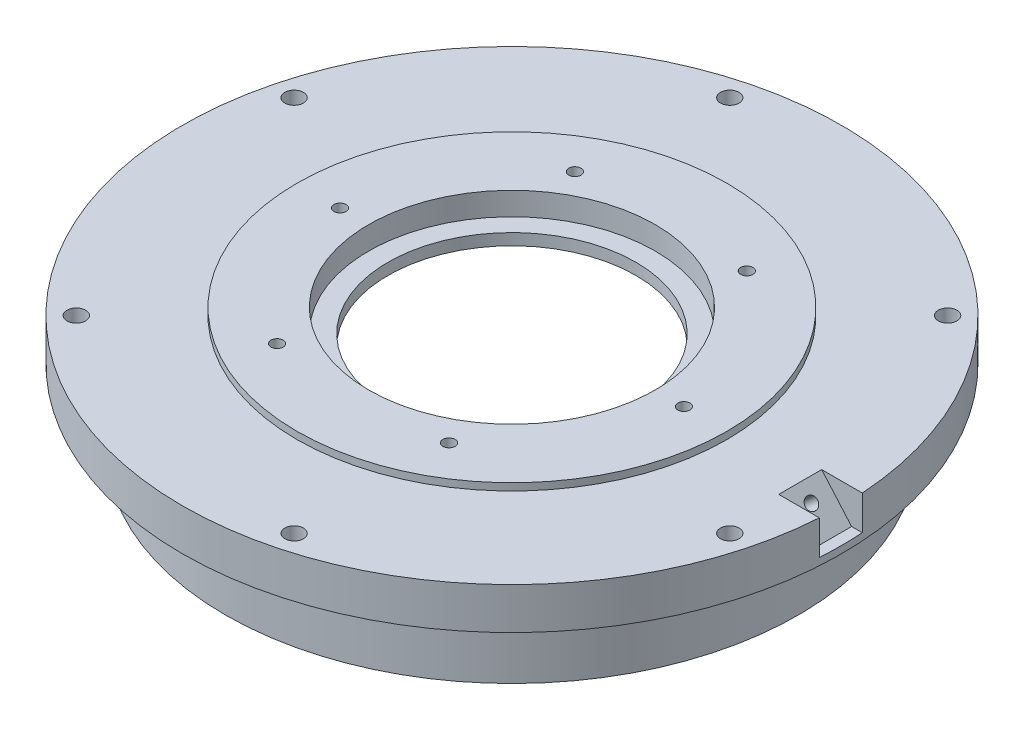
ISO-10303-21;
HEADER;
FILE_DESCRIPTION(('STEP AP214'),'2;1');
FILE_NAME('part.step','',(''),(''),'','','');
FILE_SCHEMA(('AUTOMOTIVE_DESIGN { 1 0 10303 214 1 1 1 1 }'));
ENDSEC;
DATA;
#1=APPLICATION_CONTEXT('core data for automotive mechanical design processes');
#2=APPLICATION_PROTOCOL_DEFINITION('international standard','automotive_design',2000,#1);
#3=PRODUCT_CONTEXT('',#1,'mechanical');
#4=PRODUCT('Part','Part','',(#3));
#5=PRODUCT_RELATED_PRODUCT_CATEGORY('part','',(#4));
#6=PRODUCT_DEFINITION_FORMATION('','',#4);
#7=PRODUCT_DEFINITION_CONTEXT('part definition',#1,'design');
#8=PRODUCT_DEFINITION('design','',#6,#7);
#9=PRODUCT_DEFINITION_SHAPE('','',#8);
#10=(LENGTH_UNIT() NAMED_UNIT(*) SI_UNIT(.MILLI.,.METRE.));
#11=(NAMED_UNIT(*) PLANE_ANGLE_UNIT() SI_UNIT($,.RADIAN.));
#12=(NAMED_UNIT(*) SI_UNIT($,.STERADIAN.) SOLID_ANGLE_UNIT());
#13=UNCERTAINTY_MEASURE_WITH_UNIT(LENGTH_MEASURE(1.E-05),#10,'distance_accuracy_value','');
#14=(GEOMETRIC_REPRESENTATION_CONTEXT(3) GLOBAL_UNCERTAINTY_ASSIGNED_CONTEXT((#13)) GLOBAL_UNIT_ASSIGNED_CONTEXT((#10,
#11,#12)) REPRESENTATION_CONTEXT('',''));
#15=CARTESIAN_POINT('',(0.,0.,0.));
#16=DIRECTION('',(0.,0.,1.));
#17=DIRECTION('',(1.,0.,0.));
#18=AXIS2_PLACEMENT_3D('',#15,#16,#17);
#19=CARTESIAN_POINT('',(0.,0.,0.));
#20=DIRECTION('',(0.,1.,0.));
#21=DIRECTION('',(0.,0.,1.));
#22=AXIS2_PLACEMENT_3D('',#19,#20,#21);
#23=CYLINDRICAL_SURFACE('',#22,230.);
#24=DIRECTION('',(0.,1.,0.));
#25=VECTOR('',#24,1.);
#26=CARTESIAN_POINT('',(229.51034835057,0.,-15.));
#27=LINE('',#26,#25);
#28=CARTESIAN_POINT('',(229.51034835057,-29.,-15.));
#29=VERTEX_POINT('',#28);
#30=CARTESIAN_POINT('',(229.51034835057,-5.,-15.));
#31=VERTEX_POINT('',#30);
#32=EDGE_CURVE('E82',#29,#31,#27,.T.);
#33=ORIENTED_EDGE('',*,*,#32,.F.);
#34=CARTESIAN_POINT('',(0.,-29.,0.));
#35=DIRECTION('',(0.,-1.,0.));
#36=DIRECTION('',(0.,0.,-1.));
#37=AXIS2_PLACEMENT_3D('',#34,#35,#36);
#38=CIRCLE('',#37,230.);
#39=CARTESIAN_POINT('',(229.51034835057,-29.,15.));
#40=VERTEX_POINT('',#39);
#41=EDGE_CURVE('E11',#40,#29,#38,.F.);
#42=ORIENTED_EDGE('',*,*,#41,.F.);
#43=DIRECTION('',(0.,1.,0.));
#44=VECTOR('',#43,1.);
#45=CARTESIAN_POINT('',(229.51034835057,0.,15.));
#46=LINE('',#45,#44);
#47=CARTESIAN_POINT('',(229.51034835057,-5.,15.));
#48=VERTEX_POINT('',#47);
#49=EDGE_CURVE('E99',#40,#48,#46,.T.);
#50=ORIENTED_EDGE('',*,*,#49,.T.);
#51=CARTESIAN_POINT('',(0.,-5.,0.));
#52=DIRECTION('',(0.,1.,0.));
#53=DIRECTION('',(0.,0.,1.));
#54=AXIS2_PLACEMENT_3D('',#51,#52,#53);
#55=CIRCLE('',#54,230.);
#56=EDGE_CURVE('E110',#31,#48,#55,.T.);
#57=ORIENTED_EDGE('',*,*,#56,.F.);
#58=EDGE_LOOP('',(#33,#42,#50,#57));
#59=FACE_BOUND('',#58,.T.);
#60=CARTESIAN_POINT('',(0.,-34.,0.));
#61=DIRECTION('',(0.,1.,0.));
#62=DIRECTION('',(0.,0.,1.));
#63=AXIS2_PLACEMENT_3D('',#60,#61,#62);
#64=CIRCLE('',#63,230.);
#65=CARTESIAN_POINT('',(0.,-34.,230.));
#66=VERTEX_POINT('',#65);
#67=EDGE_CURVE('E112',#66,#66,#64,.T.);
#68=ORIENTED_EDGE('',*,*,#67,.T.);
#69=EDGE_LOOP('',(#68));
#70=FACE_BOUND('',#69,.T.);
#71=ADVANCED_FACE('F36',(#59,#70),#23,.T.);
#72=CARTESIAN_POINT('',(0.,0.,0.));
#73=DIRECTION('',(0.,1.,0.));
#74=DIRECTION('',(0.,0.,1.));
#75=AXIS2_PLACEMENT_3D('',#72,#73,#74);
#76=CYLINDRICAL_SURFACE('',#75,150.);
#77=CARTESIAN_POINT('',(0.,-5.,0.));
#78=DIRECTION('',(0.,1.,0.));
#79=DIRECTION('',(0.,0.,1.));
#80=AXIS2_PLACEMENT_3D('',#77,#78,#79);
#81=CIRCLE('',#80,150.);
#82=CARTESIAN_POINT('',(0.,-5.,150.));
#83=VERTEX_POINT('',#82);
#84=EDGE_CURVE('E107',#83,#83,#81,.T.);
#85=ORIENTED_EDGE('',*,*,#84,.T.);
#86=EDGE_LOOP('',(#85));
#87=FACE_BOUND('',#86,.T.);
#88=CARTESIAN_POINT('',(0.,0.,0.));
#89=DIRECTION('',(0.,1.,0.));
#90=DIRECTION('',(0.,0.,1.));
#91=AXIS2_PLACEMENT_3D('',#88,#89,#90);
#92=CIRCLE('',#91,150.);
#93=CARTESIAN_POINT('',(0.,0.,150.));
#94=VERTEX_POINT('',#93);
#95=EDGE_CURVE('E154',#94,#94,#92,.T.);
#96=ORIENTED_EDGE('',*,*,#95,.F.);
#97=EDGE_LOOP('',(#96));
#98=FACE_BOUND('',#97,.T.);
#99=ADVANCED_FACE('F38',(#87,#98),#76,.T.);
#100=CARTESIAN_POINT('',(-150.,0.,0.));
#101=DIRECTION('',(0.,1.,0.));
#102=DIRECTION('',(0.,0.,1.));
#103=AXIS2_PLACEMENT_3D('',#100,#101,#102);
#104=PLANE('',#103);
#105=CARTESIAN_POINT('',(60.0000000000012,0.,103.923048454132));
#106=DIRECTION('',(0.,1.,0.));
#107=DIRECTION('',(-0.866025403784433,0.,0.50000000000001));
#108=AXIS2_PLACEMENT_3D('',#105,#106,#107);
#109=CIRCLE('',#108,4.25000000000001);
#110=CARTESIAN_POINT('',(56.3193920339174,0.,106.048048454132));
#111=VERTEX_POINT('',#110);
#112=EDGE_CURVE('E476',#111,#111,#109,.T.);
#113=ORIENTED_EDGE('',*,*,#112,.F.);
#114=EDGE_LOOP('',(#113));
#115=FACE_BOUND('',#114,.T.);
#116=CARTESIAN_POINT('',(-59.999999999999,0.,103.923048454133));
#117=DIRECTION('',(0.,1.,0.));
#118=DIRECTION('',(-0.866025403784443,0.,-0.499999999999992));
#119=AXIS2_PLACEMENT_3D('',#116,#117,#118);
#120=CIRCLE('',#119,4.25000000000001);
#121=CARTESIAN_POINT('',(-63.6806079660829,0.,101.798048454133));
#122=VERTEX_POINT('',#121);
#123=EDGE_CURVE('E495',#122,#122,#120,.T.);
#124=ORIENTED_EDGE('',*,*,#123,.F.);
#125=EDGE_LOOP('',(#124));
#126=FACE_BOUND('',#125,.T.);
#127=CARTESIAN_POINT('',(-120.,0.,0.));
#128=DIRECTION('',(0.,1.,0.));
#129=DIRECTION('',(0.,0.,-1.));
#130=AXIS2_PLACEMENT_3D('',#127,#128,#129);
#131=CIRCLE('',#130,4.25000000000001);
#132=CARTESIAN_POINT('',(-120.,0.,-4.25000000000001));
#133=VERTEX_POINT('',#132);
#134=EDGE_CURVE('E489',#133,#133,#131,.T.);
#135=ORIENTED_EDGE('',*,*,#134,.F.);
#136=EDGE_LOOP('',(#135));
#137=FACE_BOUND('',#136,.T.);
#138=CARTESIAN_POINT('',(-60.0000000000005,0.,-103.923048454132));
#139=DIRECTION('',(0.,1.,0.));
#140=DIRECTION('',(0.866025403784436,0.,-0.500000000000004));
#141=AXIS2_PLACEMENT_3D('',#138,#139,#140);
#142=CIRCLE('',#141,4.25000000000001);
#143=CARTESIAN_POINT('',(-56.3193920339166,0.,-106.048048454132));
#144=VERTEX_POINT('',#143);
#145=EDGE_CURVE('E483',#144,#144,#142,.T.);
#146=ORIENTED_EDGE('',*,*,#145,.F.);
#147=EDGE_LOOP('',(#146));
#148=FACE_BOUND('',#147,.T.);
#149=CARTESIAN_POINT('',(59.9999999999998,0.,-103.923048454133));
#150=DIRECTION('',(0.,1.,0.));
#151=DIRECTION('',(0.86602540378444,0.,0.499999999999998));
#152=AXIS2_PLACEMENT_3D('',#149,#150,#151);
#153=CIRCLE('',#152,4.25000000000001);
#154=CARTESIAN_POINT('',(63.6806079660836,0.,-101.798048454133));
#155=VERTEX_POINT('',#154);
#156=EDGE_CURVE('E482',#155,#155,#153,.T.);
#157=ORIENTED_EDGE('',*,*,#156,.F.);
#158=EDGE_LOOP('',(#157));
#159=FACE_BOUND('',#158,.T.);
#160=CARTESIAN_POINT('',(120.,0.,0.));
#161=DIRECTION('',(0.,1.,0.));
#162=DIRECTION('',(0.,0.,1.));
#163=AXIS2_PLACEMENT_3D('',#160,#161,#162);
#164=CIRCLE('',#163,4.25000000000001);
#165=CARTESIAN_POINT('',(120.,0.,4.25000000000001));
#166=VERTEX_POINT('',#165);
#167=EDGE_CURVE('E506',#166,#166,#164,.T.);
#168=ORIENTED_EDGE('',*,*,#167,.F.);
#169=EDGE_LOOP('',(#168));
#170=FACE_BOUND('',#169,.T.);
#171=ORIENTED_EDGE('',*,*,#95,.T.);
#172=EDGE_LOOP('',(#171));
#173=FACE_BOUND('',#172,.T.);
#174=CARTESIAN_POINT('',(0.,0.,0.));
#175=DIRECTION('',(0.,1.,0.));
#176=DIRECTION('',(0.,0.,1.));
#177=AXIS2_PLACEMENT_3D('',#174,#175,#176);
#178=CIRCLE('',#177,100.);
#179=CARTESIAN_POINT('',(0.,0.,100.));
#180=VERTEX_POINT('',#179);
#181=EDGE_CURVE('E151',#180,#180,#178,.T.);
#182=ORIENTED_EDGE('',*,*,#181,.F.);
#183=EDGE_LOOP('',(#182));
#184=FACE_BOUND('',#183,.T.);
#185=ADVANCED_FACE('F159',(#115,#126,#137,#148,#159,#170,#173,#184),#104,.T.);
#186=CARTESIAN_POINT('',(0.,0.,0.));
#187=DIRECTION('',(0.,1.,0.));
#188=DIRECTION('',(0.,0.,1.));
#189=AXIS2_PLACEMENT_3D('',#186,#187,#188);
#190=CYLINDRICAL_SURFACE('',#189,100.);
#191=ORIENTED_EDGE('',*,*,#181,.T.);
#192=EDGE_LOOP('',(#191));
#193=FACE_BOUND('',#192,.T.);
#194=CARTESIAN_POINT('',(0.,-16.,0.));
#195=DIRECTION('',(0.,1.,0.));
#196=DIRECTION('',(0.,0.,1.));
#197=AXIS2_PLACEMENT_3D('',#194,#195,#196);
#198=CIRCLE('',#197,100.);
#199=CARTESIAN_POINT('',(0.,-16.,100.));
#200=VERTEX_POINT('',#199);
#201=EDGE_CURVE('E148',#200,#200,#198,.T.);
#202=ORIENTED_EDGE('',*,*,#201,.F.);
#203=EDGE_LOOP('',(#202));
#204=FACE_BOUND('',#203,.T.);
#205=ADVANCED_FACE('F168',(#193,#204),#190,.F.);
#206=CARTESIAN_POINT('',(-100.,-16.,0.));
#207=DIRECTION('',(0.,1.,0.));
#208=DIRECTION('',(0.,0.,1.));
#209=AXIS2_PLACEMENT_3D('',#206,#207,#208);
#210=PLANE('',#209);
#211=ORIENTED_EDGE('',*,*,#201,.T.);
#212=EDGE_LOOP('',(#211));
#213=FACE_BOUND('',#212,.T.);
#214=CARTESIAN_POINT('',(0.,-16.,0.));
#215=DIRECTION('',(0.,1.,0.));
#216=DIRECTION('',(0.,0.,1.));
#217=AXIS2_PLACEMENT_3D('',#214,#215,#216);
#218=CIRCLE('',#217,86.5);
#219=CARTESIAN_POINT('',(0.,-16.,86.5));
#220=VERTEX_POINT('',#219);
#221=EDGE_CURVE('E145',#220,#220,#218,.T.);
#222=ORIENTED_EDGE('',*,*,#221,.F.);
#223=EDGE_LOOP('',(#222));
#224=FACE_BOUND('',#223,.T.);
#225=ADVANCED_FACE('F228',(#213,#224),#210,.T.);
#226=CARTESIAN_POINT('',(0.,0.,0.));
#227=DIRECTION('',(0.,1.,0.));
#228=DIRECTION('',(0.,0.,1.));
#229=AXIS2_PLACEMENT_3D('',#226,#227,#228);
#230=CYLINDRICAL_SURFACE('',#229,86.5);
#231=ORIENTED_EDGE('',*,*,#221,.T.);
#232=EDGE_LOOP('',(#231));
#233=FACE_BOUND('',#232,.T.);
#234=CARTESIAN_POINT('',(0.,-24.,0.));
#235=DIRECTION('',(0.,1.,0.));
#236=DIRECTION('',(0.,0.,1.));
#237=AXIS2_PLACEMENT_3D('',#234,#235,#236);
#238=CIRCLE('',#237,86.5);
#239=CARTESIAN_POINT('',(0.,-24.,86.5));
#240=VERTEX_POINT('',#239);
#241=EDGE_CURVE('E142',#240,#240,#238,.T.);
#242=ORIENTED_EDGE('',*,*,#241,.F.);
#243=EDGE_LOOP('',(#242));
#244=FACE_BOUND('',#243,.T.);
#245=ADVANCED_FACE('F224',(#233,#244),#230,.F.);
#246=CARTESIAN_POINT('',(-86.5,-24.,0.));
#247=DIRECTION('',(0.,-1.,0.));
#248=DIRECTION('',(0.,0.,-1.));
#249=AXIS2_PLACEMENT_3D('',#246,#247,#248);
#250=PLANE('',#249);
#251=ORIENTED_EDGE('',*,*,#241,.T.);
#252=EDGE_LOOP('',(#251));
#253=FACE_BOUND('',#252,.T.);
#254=CARTESIAN_POINT('',(0.,-24.,0.));
#255=DIRECTION('',(0.,1.,0.));
#256=DIRECTION('',(0.,0.,1.));
#257=AXIS2_PLACEMENT_3D('',#254,#255,#256);
#258=CIRCLE('',#257,170.);
#259=CARTESIAN_POINT('',(0.,-24.,170.));
#260=VERTEX_POINT('',#259);
#261=EDGE_CURVE('E139',#260,#260,#258,.T.);
#262=ORIENTED_EDGE('',*,*,#261,.F.);
#263=EDGE_LOOP('',(#262));
#264=FACE_BOUND('',#263,.T.);
#265=ADVANCED_FACE('F220',(#253,#264),#250,.T.);
#266=CARTESIAN_POINT('',(0.,-43.9999999999999,0.));
#267=DIRECTION('',(0.,-1.,0.));
#268=DIRECTION('',(0.,0.,-1.));
#269=AXIS2_PLACEMENT_3D('',#266,#267,#268);
#270=CONICAL_SURFACE('',#269,190.,0.78539816339745);
#271=CARTESIAN_POINT('',(180.511481727089,-34.5274734512081,-2.40283902239297));
#272=CARTESIAN_POINT('',(180.417233751974,-34.4308468569237,-2.2234780199374));
#273=CARTESIAN_POINT('',(180.33356404573,-34.344909079238,-2.032597699933));
#274=CARTESIAN_POINT('',(180.189775458586,-34.1970673732498,-1.63325241196564));
#275=CARTESIAN_POINT('',(180.129684608111,-34.1351920510489,-1.42476687047765));
#276=CARTESIAN_POINT('',(180.034804585052,-34.0374346822704,-0.996342846806657));
#277=CARTESIAN_POINT('',(180.000004259494,-34.0015411778919,-0.776409458967654));
#278=CARTESIAN_POINT('',(179.956627915975,-33.9567954827483,-0.331328957005012));
#279=CARTESIAN_POINT('',(179.948045470409,-33.9479366641318,-0.106183134407568));
#280=CARTESIAN_POINT('',(179.957314381785,-33.9575010343507,0.342899428680555));
#281=CARTESIAN_POINT('',(179.975155944447,-33.9759141146289,0.566836586298707));
#282=CARTESIAN_POINT('',(180.036772613076,-34.0394555678606,1.00723581334373));
#283=CARTESIAN_POINT('',(180.080548675786,-34.0845849263987,1.22369760668672));
#284=CARTESIAN_POINT('',(180.192845305135,-34.2002140488859,1.64300121440554));
#285=CARTESIAN_POINT('',(180.261366291176,-34.2707142428479,1.84584279786193));
#286=CARTESIAN_POINT('',(180.421284156504,-34.4349890954986,2.23215755355802));
#287=CARTESIAN_POINT('',(180.512681040898,-34.5287637593838,2.41563072147336));
#288=CARTESIAN_POINT('',(180.715927374345,-34.73689419222,2.75815683736391));
#289=CARTESIAN_POINT('',(180.827792227841,-34.8512654613978,2.91719122542888));
#290=CARTESIAN_POINT('',(181.068851305519,-35.097178967482,3.20619213860116));
#291=CARTESIAN_POINT('',(181.198045611861,-35.2287212857972,3.3361585258879));
#292=CARTESIAN_POINT('',(181.470397641728,-35.5053489277674,3.5635488521173));
#293=CARTESIAN_POINT('',(181.613575765738,-35.6504540240012,3.66092430084878));
#294=CARTESIAN_POINT('',(181.909751821622,-35.94984321983,3.82014886302381));
#295=CARTESIAN_POINT('',(182.062749869685,-36.104127428032,3.88199755602417));
#296=CARTESIAN_POINT('',(182.374597688186,-36.4177666692115,3.96854263634386));
#297=CARTESIAN_POINT('',(182.533458393194,-36.5771310933327,3.99316559040498));
#298=CARTESIAN_POINT('',(182.852267392597,-36.8961087135291,4.00435946357775));
#299=CARTESIAN_POINT('',(183.012215699137,-37.0557219123671,3.99092995703211));
#300=CARTESIAN_POINT('',(183.328934761978,-37.3709719269589,3.92635725395824));
#301=CARTESIAN_POINT('',(183.485699595893,-37.5266014507916,3.87514939325692));
#302=CARTESIAN_POINT('',(183.79127306051,-37.8292345310411,3.73639357281012));
#303=CARTESIAN_POINT('',(183.940081646377,-37.9762380388484,3.64884540830173));
#304=CARTESIAN_POINT('',(184.225488641976,-38.2575687790778,3.43983132564265));
#305=CARTESIAN_POINT('',(184.362082590036,-38.3918913805021,3.31835308003129));
#306=CARTESIAN_POINT('',(184.619000646752,-38.644056591843,3.0449093930945));
#307=CARTESIAN_POINT('',(184.73932486336,-38.7618993111063,2.89294415407188));
#308=CARTESIAN_POINT('',(184.959954884075,-38.9776384652508,2.56309374706751));
#309=CARTESIAN_POINT('',(185.060293885397,-39.0755679834817,2.38525242665819));
#310=CARTESIAN_POINT('',(185.23820580474,-39.248997599873,2.00849332834165));
#311=CARTESIAN_POINT('',(185.315779119433,-39.3244980888395,1.80957591774866));
#312=CARTESIAN_POINT('',(185.445611355287,-39.4507581947692,1.39698082028717));
#313=CARTESIAN_POINT('',(185.497949277683,-39.5015950262511,1.18335162179619));
#314=CARTESIAN_POINT('',(185.576087662446,-39.5774620481559,0.746857743241874));
#315=CARTESIAN_POINT('',(185.601888613473,-39.6024927137826,0.523993233319401));
#316=CARTESIAN_POINT('',(185.626133265338,-39.6260140839588,0.076033152858678));
#317=CARTESIAN_POINT('',(185.624654491483,-39.6245799977673,-0.149054278942545));
#318=CARTESIAN_POINT('',(185.594575,-39.5953965331394,-0.595681484608237));
#319=CARTESIAN_POINT('',(185.565974468482,-39.5676473352775,-0.817221282805989));
#320=CARTESIAN_POINT('',(185.482547999953,-39.4866353662249,-1.25030987727162));
#321=CARTESIAN_POINT('',(185.427740552024,-39.4333905822322,-1.46186560190974));
#322=CARTESIAN_POINT('',(185.293556166725,-39.3028710785216,-1.86918068623923));
#323=CARTESIAN_POINT('',(185.214179057242,-39.2255961904688,-2.06493993526162));
#324=CARTESIAN_POINT('',(185.033047629421,-39.0489816312082,-2.43551695079216));
#325=CARTESIAN_POINT('',(184.931251195398,-38.9496004287566,-2.61029433422254));
#326=CARTESIAN_POINT('',(184.708377048393,-38.7315991770255,-2.93358281084903));
#327=CARTESIAN_POINT('',(184.587298963637,-38.6129787567888,-3.08209339747152));
#328=CARTESIAN_POINT('',(184.328978379176,-38.3593514839948,-3.34914251772261));
#329=CARTESIAN_POINT('',(184.19168475309,-38.2242927595357,-3.46758233319602));
#330=CARTESIAN_POINT('',(183.905237055448,-37.9418338457152,-3.67055010071141));
#331=CARTESIAN_POINT('',(183.756082772966,-37.7944334368681,-3.75507744949642));
#332=CARTESIAN_POINT('',(183.449797865174,-37.4909813037307,-3.88803096102671));
#333=CARTESIAN_POINT('',(183.292647273198,-37.3349078235053,-3.93636148843971));
#334=CARTESIAN_POINT('',(182.975240208342,-37.0188485761472,-3.99518489632217));
#335=CARTESIAN_POINT('',(182.81498383805,-36.8588629381914,-4.00567902443123));
#336=CARTESIAN_POINT('',(182.495820825803,-36.5394008114623,-3.98851556360043));
#337=CARTESIAN_POINT('',(182.336915048049,-36.3799246842607,-3.96083516222548));
#338=CARTESIAN_POINT('',(182.0250055317,-36.0660934677611,-3.86802032870164));
#339=CARTESIAN_POINT('',(181.872003237831,-35.9117396332902,-3.80287678966883));
#340=CARTESIAN_POINT('',(181.576362672954,-35.612766816628,-3.63702283876253));
#341=CARTESIAN_POINT('',(181.433717720099,-35.4681415627347,-3.53633560751533));
#342=CARTESIAN_POINT('',(181.162788765661,-35.1928477698761,-3.30228037916537));
#343=CARTESIAN_POINT('',(181.034487588089,-35.0621625471841,-3.16895209219441));
#344=CARTESIAN_POINT('',(180.840380576431,-34.8640722364197,-2.92876870588417));
#345=CARTESIAN_POINT('',(180.769129084576,-34.7912608924969,-2.83062119052432));
#346=CARTESIAN_POINT('',(180.634348001269,-34.6533786072348,-2.62411742714774));
#347=CARTESIAN_POINT('',(180.570818402321,-34.5883076583822,-2.51576118904033));
#348=CARTESIAN_POINT('',(180.511481727089,-34.5274734512081,-2.40283902239297));
#349=B_SPLINE_CURVE_WITH_KNOTS('',3,(#271,#272,#273,#274,#275,#276,#277,#278,#279,#280,#281,
#282,#283,#284,#285,#286,#287,#288,#289,#290,#291,#292,#293,#294,#295,#296,#297,#298,#299,#300,
#301,#302,#303,#304,#305,#306,#307,#308,#309,#310,#311,#312,#313,#314,#315,#316,#317,#318,#319,
#320,#321,#322,#323,#324,#325,#326,#327,#328,#329,#330,#331,#332,#333,#334,#335,#336,#337,#338,
#339,#340,#341,#342,#343,#344,#345,#346,#347,#348),.UNSPECIFIED.,.T.,.F.,(4,2,2,2,2,2,2,2,2,2,2,
2,2,2,2,2,2,2,2,2,2,2,2,2,2,2,2,2,2,2,2,2,2,2,2,2,2,2,4),(0.,0.672914641487422,1.34662683435662,
2.02004174353098,2.69329154434715,3.3662918619434,4.03931700859783,4.71235356295896,
5.38539026758794,6.05893560708467,6.73248414000495,7.40703039839835,8.08158463957934,
8.75746781011072,9.43335854114504,10.1104088678806,10.7874630095726,11.4647634589403,
12.1420594140882,12.8182207618188,13.4943703273431,14.1683891878596,14.8423956365355,
15.5144869454151,16.1865736424324,16.8581868776985,17.5298048178302,18.2026953498163,
18.8755988575545,19.5506836537265,20.2257804582128,20.9026546985171,21.5795066189695,
22.2567631896708,22.9341844637582,23.6111647558982,24.2873255114418,24.7109797729754,
25.1346336232839),.UNSPECIFIED.);
#350=CARTESIAN_POINT('',(180.511481727089,-34.5274734512081,-2.40283902239297));
#351=VERTEX_POINT('',#350);
#352=EDGE_CURVE('E428',#351,#351,#349,.T.);
#353=ORIENTED_EDGE('',*,*,#352,.T.);
#354=EDGE_LOOP('',(#353));
#355=FACE_BOUND('',#354,.T.);
#356=ORIENTED_EDGE('',*,*,#261,.T.);
#357=EDGE_LOOP('',(#356));
#358=FACE_BOUND('',#357,.T.);
#359=CARTESIAN_POINT('',(0.,-43.9999999999999,0.));
#360=DIRECTION('',(0.,1.,0.));
#361=DIRECTION('',(0.,0.,1.));
#362=AXIS2_PLACEMENT_3D('',#359,#360,#361);
#363=CIRCLE('',#362,190.);
#364=CARTESIAN_POINT('',(0.,-43.9999999999999,190.));
#365=VERTEX_POINT('',#364);
#366=EDGE_CURVE('E136',#365,#365,#363,.T.);
#367=ORIENTED_EDGE('',*,*,#366,.F.);
#368=EDGE_LOOP('',(#367));
#369=FACE_BOUND('',#368,.T.);
#370=ADVANCED_FACE('F216',(#355,#358,#369),#270,.F.);
#371=CARTESIAN_POINT('',(0.,0.,0.));
#372=DIRECTION('',(0.,1.,0.));
#373=DIRECTION('',(0.,0.,1.));
#374=AXIS2_PLACEMENT_3D('',#371,#372,#373);
#375=CYLINDRICAL_SURFACE('',#374,190.);
#376=ORIENTED_EDGE('',*,*,#366,.T.);
#377=EDGE_LOOP('',(#376));
#378=FACE_BOUND('',#377,.T.);
#379=CARTESIAN_POINT('',(0.,-54.5,0.));
#380=DIRECTION('',(0.,1.,0.));
#381=DIRECTION('',(0.,0.,1.));
#382=AXIS2_PLACEMENT_3D('',#379,#380,#381);
#383=CIRCLE('',#382,190.);
#384=CARTESIAN_POINT('',(0.,-54.5,190.));
#385=VERTEX_POINT('',#384);
#386=EDGE_CURVE('E133',#385,#385,#383,.T.);
#387=ORIENTED_EDGE('',*,*,#386,.F.);
#388=EDGE_LOOP('',(#387));
#389=FACE_BOUND('',#388,.T.);
#390=ADVANCED_FACE('F212',(#378,#389),#375,.F.);
#391=CARTESIAN_POINT('',(-190.,-54.5,0.));
#392=DIRECTION('',(0.,1.,0.));
#393=DIRECTION('',(0.,0.,1.));
#394=AXIS2_PLACEMENT_3D('',#391,#392,#393);
#395=PLANE('',#394);
#396=ORIENTED_EDGE('',*,*,#386,.T.);
#397=EDGE_LOOP('',(#396));
#398=FACE_BOUND('',#397,.T.);
#399=CARTESIAN_POINT('',(0.,-54.5,0.));
#400=DIRECTION('',(0.,1.,0.));
#401=DIRECTION('',(0.,0.,1.));
#402=AXIS2_PLACEMENT_3D('',#399,#400,#401);
#403=CIRCLE('',#402,180.);
#404=CARTESIAN_POINT('',(0.,-54.5,180.));
#405=VERTEX_POINT('',#404);
#406=EDGE_CURVE('E130',#405,#405,#403,.T.);
#407=ORIENTED_EDGE('',*,*,#406,.F.);
#408=EDGE_LOOP('',(#407));
#409=FACE_BOUND('',#408,.T.);
#410=ADVANCED_FACE('F208',(#398,#409),#395,.T.);
#411=CARTESIAN_POINT('',(0.,0.,0.));
#412=DIRECTION('',(0.,1.,0.));
#413=DIRECTION('',(0.,0.,1.));
#414=AXIS2_PLACEMENT_3D('',#411,#412,#413);
#415=CYLINDRICAL_SURFACE('',#414,180.);
#416=ORIENTED_EDGE('',*,*,#406,.T.);
#417=EDGE_LOOP('',(#416));
#418=FACE_BOUND('',#417,.T.);
#419=CARTESIAN_POINT('',(0.,-76.,0.));
#420=DIRECTION('',(0.,1.,0.));
#421=DIRECTION('',(0.,0.,1.));
#422=AXIS2_PLACEMENT_3D('',#419,#420,#421);
#423=CIRCLE('',#422,180.);
#424=CARTESIAN_POINT('',(0.,-76.,180.));
#425=VERTEX_POINT('',#424);
#426=EDGE_CURVE('E127',#425,#425,#423,.T.);
#427=ORIENTED_EDGE('',*,*,#426,.F.);
#428=EDGE_LOOP('',(#427));
#429=FACE_BOUND('',#428,.T.);
#430=ADVANCED_FACE('F204',(#418,#429),#415,.F.);
#431=CARTESIAN_POINT('',(-180.,-76.,0.));
#432=DIRECTION('',(0.,-1.,0.));
#433=DIRECTION('',(0.,0.,-1.));
#434=AXIS2_PLACEMENT_3D('',#431,#432,#433);
#435=PLANE('',#434);
#436=ORIENTED_EDGE('',*,*,#426,.T.);
#437=EDGE_LOOP('',(#436));
#438=FACE_BOUND('',#437,.T.);
#439=CARTESIAN_POINT('',(0.,-76.,0.));
#440=DIRECTION('',(0.,1.,0.));
#441=DIRECTION('',(0.,0.,1.));
#442=AXIS2_PLACEMENT_3D('',#439,#440,#441);
#443=CIRCLE('',#442,195.);
#444=CARTESIAN_POINT('',(0.,-76.,195.));
#445=VERTEX_POINT('',#444);
#446=EDGE_CURVE('E124',#445,#445,#443,.T.);
#447=ORIENTED_EDGE('',*,*,#446,.F.);
#448=EDGE_LOOP('',(#447));
#449=FACE_BOUND('',#448,.T.);
#450=ADVANCED_FACE('F200',(#438,#449),#435,.T.);
#451=CARTESIAN_POINT('',(0.,0.,0.));
#452=DIRECTION('',(0.,1.,0.));
#453=DIRECTION('',(0.,0.,1.));
#454=AXIS2_PLACEMENT_3D('',#451,#452,#453);
#455=CYLINDRICAL_SURFACE('',#454,195.);
#456=ORIENTED_EDGE('',*,*,#446,.T.);
#457=EDGE_LOOP('',(#456));
#458=FACE_BOUND('',#457,.T.);
#459=CARTESIAN_POINT('',(0.,-86.,0.));
#460=DIRECTION('',(0.,1.,0.));
#461=DIRECTION('',(0.,0.,1.));
#462=AXIS2_PLACEMENT_3D('',#459,#460,#461);
#463=CIRCLE('',#462,195.);
#464=CARTESIAN_POINT('',(0.,-86.,195.));
#465=VERTEX_POINT('',#464);
#466=EDGE_CURVE('E121',#465,#465,#463,.T.);
#467=ORIENTED_EDGE('',*,*,#466,.F.);
#468=EDGE_LOOP('',(#467));
#469=FACE_BOUND('',#468,.T.);
#470=ADVANCED_FACE('F196',(#458,#469),#455,.F.);
#471=CARTESIAN_POINT('',(-195.,-86.,0.));
#472=DIRECTION('',(0.,-1.,0.));
#473=DIRECTION('',(0.,0.,-1.));
#474=AXIS2_PLACEMENT_3D('',#471,#472,#473);
#475=PLANE('',#474);
#476=ORIENTED_EDGE('',*,*,#466,.T.);
#477=EDGE_LOOP('',(#476));
#478=FACE_BOUND('',#477,.T.);
#479=CARTESIAN_POINT('',(0.,-86.,0.));
#480=DIRECTION('',(0.,1.,0.));
#481=DIRECTION('',(0.,0.,1.));
#482=AXIS2_PLACEMENT_3D('',#479,#480,#481);
#483=CIRCLE('',#482,200.);
#484=CARTESIAN_POINT('',(0.,-86.,200.));
#485=VERTEX_POINT('',#484);
#486=EDGE_CURVE('E118',#485,#485,#483,.T.);
#487=ORIENTED_EDGE('',*,*,#486,.F.);
#488=EDGE_LOOP('',(#487));
#489=FACE_BOUND('',#488,.T.);
#490=ADVANCED_FACE('F192',(#478,#489),#475,.T.);
#491=CARTESIAN_POINT('',(0.,0.,0.));
#492=DIRECTION('',(0.,1.,0.));
#493=DIRECTION('',(0.,0.,1.));
#494=AXIS2_PLACEMENT_3D('',#491,#492,#493);
#495=CYLINDRICAL_SURFACE('',#494,200.);
#496=ORIENTED_EDGE('',*,*,#486,.T.);
#497=EDGE_LOOP('',(#496));
#498=FACE_BOUND('',#497,.T.);
#499=CARTESIAN_POINT('',(0.,-34.,0.));
#500=DIRECTION('',(0.,1.,0.));
#501=DIRECTION('',(0.,0.,1.));
#502=AXIS2_PLACEMENT_3D('',#499,#500,#501);
#503=CIRCLE('',#502,200.);
#504=CARTESIAN_POINT('',(0.,-34.,200.));
#505=VERTEX_POINT('',#504);
#506=EDGE_CURVE('E115',#505,#505,#503,.T.);
#507=ORIENTED_EDGE('',*,*,#506,.F.);
#508=EDGE_LOOP('',(#507));
#509=FACE_BOUND('',#508,.T.);
#510=ADVANCED_FACE('F183',(#498,#509),#495,.T.);
#511=CARTESIAN_POINT('',(-200.,-34.,0.));
#512=DIRECTION('',(0.,-1.,0.));
#513=DIRECTION('',(0.,0.,-1.));
#514=AXIS2_PLACEMENT_3D('',#511,#512,#513);
#515=PLANE('',#514);
#516=CARTESIAN_POINT('',(207.67405265215,-34.,55.6460946970413));
#517=DIRECTION('',(0.,-1.,0.));
#518=DIRECTION('',(0.,0.,-1.));
#519=AXIS2_PLACEMENT_3D('',#516,#517,#518);
#520=CIRCLE('',#519,6.5);
#521=CARTESIAN_POINT('',(207.67405265215,-34.,49.1460946970413));
#522=VERTEX_POINT('',#521);
#523=EDGE_CURVE('E447',#522,#522,#520,.F.);
#524=ORIENTED_EDGE('',*,*,#523,.T.);
#525=EDGE_LOOP('',(#524));
#526=FACE_BOUND('',#525,.T.);
#527=CARTESIAN_POINT('',(152.027957955107,-34.,-152.027957955109));
#528=DIRECTION('',(0.,-1.,0.));
#529=DIRECTION('',(0.,0.,-1.));
#530=AXIS2_PLACEMENT_3D('',#527,#528,#529);
#531=CIRCLE('',#530,6.5);
#532=CARTESIAN_POINT('',(152.027957955107,-34.,-158.527957955109));
#533=VERTEX_POINT('',#532);
#534=EDGE_CURVE('E453',#533,#533,#531,.F.);
#535=ORIENTED_EDGE('',*,*,#534,.T.);
#536=EDGE_LOOP('',(#535));
#537=FACE_BOUND('',#536,.T.);
#538=CARTESIAN_POINT('',(-55.6460946970421,-34.,-207.67405265215));
#539=DIRECTION('',(0.,-1.,0.));
#540=DIRECTION('',(0.,0.,-1.));
#541=AXIS2_PLACEMENT_3D('',#538,#539,#540);
#542=CIRCLE('',#541,6.5);
#543=CARTESIAN_POINT('',(-55.6460946970421,-34.,-214.17405265215));
#544=VERTEX_POINT('',#543);
#545=EDGE_CURVE('E459',#544,#544,#542,.F.);
#546=ORIENTED_EDGE('',*,*,#545,.T.);
#547=EDGE_LOOP('',(#546));
#548=FACE_BOUND('',#547,.T.);
#549=CARTESIAN_POINT('',(-207.67405265215,-34.,-55.6460946970398));
#550=DIRECTION('',(0.,-1.,0.));
#551=DIRECTION('',(0.,0.,-1.));
#552=AXIS2_PLACEMENT_3D('',#549,#550,#551);
#553=CIRCLE('',#552,6.5);
#554=CARTESIAN_POINT('',(-207.67405265215,-34.,-62.1460946970398));
#555=VERTEX_POINT('',#554);
#556=EDGE_CURVE('E465',#555,#555,#553,.F.);
#557=ORIENTED_EDGE('',*,*,#556,.T.);
#558=EDGE_LOOP('',(#557));
#559=FACE_BOUND('',#558,.T.);
#560=CARTESIAN_POINT('',(-152.027957955106,-34.,152.02795795511));
#561=DIRECTION('',(0.,-1.,0.));
#562=DIRECTION('',(0.,0.,-1.));
#563=AXIS2_PLACEMENT_3D('',#560,#561,#562);
#564=CIRCLE('',#563,6.5);
#565=CARTESIAN_POINT('',(-152.027957955106,-34.,145.52795795511));
#566=VERTEX_POINT('',#565);
#567=EDGE_CURVE('E440',#566,#566,#564,.F.);
#568=ORIENTED_EDGE('',*,*,#567,.T.);
#569=EDGE_LOOP('',(#568));
#570=FACE_BOUND('',#569,.T.);
#571=CARTESIAN_POINT('',(55.6460946970421,-34.,207.67405265215));
#572=DIRECTION('',(0.,-1.,0.));
#573=DIRECTION('',(0.,0.,-1.));
#574=AXIS2_PLACEMENT_3D('',#571,#572,#573);
#575=CIRCLE('',#574,6.5);
#576=CARTESIAN_POINT('',(55.6460946970421,-34.,201.17405265215));
#577=VERTEX_POINT('',#576);
#578=EDGE_CURVE('E446',#577,#577,#575,.F.);
#579=ORIENTED_EDGE('',*,*,#578,.T.);
#580=EDGE_LOOP('',(#579));
#581=FACE_BOUND('',#580,.T.);
#582=ORIENTED_EDGE('',*,*,#506,.T.);
#583=EDGE_LOOP('',(#582));
#584=FACE_BOUND('',#583,.T.);
#585=ORIENTED_EDGE('',*,*,#67,.F.);
#586=EDGE_LOOP('',(#585));
#587=FACE_BOUND('',#586,.T.);
#588=ADVANCED_FACE('F175',(#526,#537,#548,#559,#570,#581,#584,#587),#515,.T.);
#589=CARTESIAN_POINT('',(-230.,-5.,0.));
#590=DIRECTION('',(0.,1.,0.));
#591=DIRECTION('',(0.,0.,1.));
#592=AXIS2_PLACEMENT_3D('',#589,#590,#591);
#593=PLANE('',#592);
#594=CARTESIAN_POINT('',(207.67405265215,-5.,55.6460946970413));
#595=DIRECTION('',(0.,1.,0.));
#596=DIRECTION('',(0.86602540378444,0.,0.499999999999998));
#597=AXIS2_PLACEMENT_3D('',#594,#595,#596);
#598=CIRCLE('',#597,6.5);
#599=CARTESIAN_POINT('',(213.303217776749,-5.,58.8960946970413));
#600=VERTEX_POINT('',#599);
#601=EDGE_CURVE('E443',#600,#600,#598,.T.);
#602=ORIENTED_EDGE('',*,*,#601,.F.);
#603=EDGE_LOOP('',(#602));
#604=FACE_BOUND('',#603,.T.);
#605=CARTESIAN_POINT('',(152.027957955107,-5.,-152.027957955109));
#606=DIRECTION('',(0.,1.,0.));
#607=DIRECTION('',(0.866025403784436,0.,-0.500000000000004));
#608=AXIS2_PLACEMENT_3D('',#605,#606,#607);
#609=CIRCLE('',#608,6.5);
#610=CARTESIAN_POINT('',(157.657123079706,-5.,-155.277957955109));
#611=VERTEX_POINT('',#610);
#612=EDGE_CURVE('E450',#611,#611,#609,.T.);
#613=ORIENTED_EDGE('',*,*,#612,.F.);
#614=EDGE_LOOP('',(#613));
#615=FACE_BOUND('',#614,.T.);
#616=CARTESIAN_POINT('',(-55.6460946970421,-5.,-207.67405265215));
#617=DIRECTION('',(0.,1.,0.));
#618=DIRECTION('',(0.,0.,-1.));
#619=AXIS2_PLACEMENT_3D('',#616,#617,#618);
#620=CIRCLE('',#619,6.5);
#621=CARTESIAN_POINT('',(-55.6460946970421,-5.,-214.17405265215));
#622=VERTEX_POINT('',#621);
#623=EDGE_CURVE('E456',#622,#622,#620,.T.);
#624=ORIENTED_EDGE('',*,*,#623,.F.);
#625=EDGE_LOOP('',(#624));
#626=FACE_BOUND('',#625,.T.);
#627=CARTESIAN_POINT('',(-207.67405265215,-5.,-55.6460946970398));
#628=DIRECTION('',(0.,1.,0.));
#629=DIRECTION('',(-0.866025403784443,0.,-0.499999999999992));
#630=AXIS2_PLACEMENT_3D('',#627,#628,#629);
#631=CIRCLE('',#630,6.5);
#632=CARTESIAN_POINT('',(-213.303217776749,-5.,-58.8960946970398));
#633=VERTEX_POINT('',#632);
#634=EDGE_CURVE('E462',#633,#633,#631,.T.);
#635=ORIENTED_EDGE('',*,*,#634,.F.);
#636=EDGE_LOOP('',(#635));
#637=FACE_BOUND('',#636,.T.);
#638=CARTESIAN_POINT('',(-152.027957955106,-5.,152.02795795511));
#639=DIRECTION('',(0.,1.,0.));
#640=DIRECTION('',(-0.866025403784433,0.,0.50000000000001));
#641=AXIS2_PLACEMENT_3D('',#638,#639,#640);
#642=CIRCLE('',#641,6.5);
#643=CARTESIAN_POINT('',(-157.657123079705,-5.,155.27795795511));
#644=VERTEX_POINT('',#643);
#645=EDGE_CURVE('E468',#644,#644,#642,.T.);
#646=ORIENTED_EDGE('',*,*,#645,.F.);
#647=EDGE_LOOP('',(#646));
#648=FACE_BOUND('',#647,.T.);
#649=CARTESIAN_POINT('',(55.6460946970421,-5.,207.67405265215));
#650=DIRECTION('',(0.,1.,0.));
#651=DIRECTION('',(0.,0.,1.));
#652=AXIS2_PLACEMENT_3D('',#649,#650,#651);
#653=CIRCLE('',#652,6.5);
#654=CARTESIAN_POINT('',(55.6460946970421,-5.,214.17405265215));
#655=VERTEX_POINT('',#654);
#656=EDGE_CURVE('E473',#655,#655,#653,.T.);
#657=ORIENTED_EDGE('',*,*,#656,.F.);
#658=EDGE_LOOP('',(#657));
#659=FACE_BOUND('',#658,.T.);
#660=DIRECTION('',(-1.,0.,0.));
#661=VECTOR('',#660,1.);
#662=CARTESIAN_POINT('',(-230.,-5.,-15.));
#663=LINE('',#662,#661);
#664=CARTESIAN_POINT('',(201.176419359654,-5.,-15.));
#665=VERTEX_POINT('',#664);
#666=EDGE_CURVE('E44',#31,#665,#663,.T.);
#667=ORIENTED_EDGE('',*,*,#666,.F.);
#668=ORIENTED_EDGE('',*,*,#56,.T.);
#669=DIRECTION('',(-1.,0.,0.));
#670=VECTOR('',#669,1.);
#671=CARTESIAN_POINT('',(-230.,-5.,15.));
#672=LINE('',#671,#670);
#673=CARTESIAN_POINT('',(201.176419359654,-5.,15.));
#674=VERTEX_POINT('',#673);
#675=EDGE_CURVE('E87',#48,#674,#672,.T.);
#676=ORIENTED_EDGE('',*,*,#675,.T.);
#677=DIRECTION('',(0.,0.,1.));
#678=VECTOR('',#677,1.);
#679=CARTESIAN_POINT('',(201.176419359654,-5.,-15.));
#680=LINE('',#679,#678);
#681=EDGE_CURVE('E90',#665,#674,#680,.T.);
#682=ORIENTED_EDGE('',*,*,#681,.F.);
#683=EDGE_LOOP('',(#667,#668,#676,#682));
#684=FACE_BOUND('',#683,.T.);
#685=ORIENTED_EDGE('',*,*,#84,.F.);
#686=EDGE_LOOP('',(#685));
#687=FACE_BOUND('',#686,.T.);
#688=ADVANCED_FACE('F96',(#604,#615,#626,#637,#648,#659,#684,#687),#593,.T.);
#689=CARTESIAN_POINT('',(222.039301067243,-29.,-15.));
#690=DIRECTION('',(0.,-1.,0.));
#691=DIRECTION('',(0.,0.,-1.));
#692=AXIS2_PLACEMENT_3D('',#689,#690,#691);
#693=PLANE('',#692);
#694=ORIENTED_EDGE('',*,*,#41,.T.);
#695=DIRECTION('',(1.,0.,0.));
#696=VECTOR('',#695,1.);
#697=CARTESIAN_POINT('',(222.039301067243,-29.,-15.));
#698=LINE('',#697,#696);
#699=CARTESIAN_POINT('',(222.039301067243,-29.,-15.));
#700=VERTEX_POINT('',#699);
#701=EDGE_CURVE('E93',#700,#29,#698,.T.);
#702=ORIENTED_EDGE('',*,*,#701,.F.);
#703=DIRECTION('',(0.,0.,1.));
#704=VECTOR('',#703,1.);
#705=CARTESIAN_POINT('',(222.039301067243,-29.,-15.));
#706=LINE('',#705,#704);
#707=CARTESIAN_POINT('',(222.039301067243,-29.,15.));
#708=VERTEX_POINT('',#707);
#709=EDGE_CURVE('E92',#700,#708,#706,.T.);
#710=ORIENTED_EDGE('',*,*,#709,.T.);
#711=DIRECTION('',(1.,0.,0.));
#712=VECTOR('',#711,1.);
#713=CARTESIAN_POINT('',(222.039301067243,-29.,15.));
#714=LINE('',#713,#712);
#715=EDGE_CURVE('E94',#708,#40,#714,.T.);
#716=ORIENTED_EDGE('',*,*,#715,.T.);
#717=EDGE_LOOP('',(#694,#702,#710,#716));
#718=FACE_BOUND('',#717,.T.);
#719=ADVANCED_FACE('F174',(#718),#693,.F.);
#720=CARTESIAN_POINT('',(201.176419359654,-5.,-15.));
#721=DIRECTION('',(-0.75470958022277,-0.656059028990509,0.));
#722=DIRECTION('',(0.656059028990509,-0.754709580222771,0.));
#723=AXIS2_PLACEMENT_3D('',#720,#721,#722);
#724=PLANE('',#723);
#725=CARTESIAN_POINT('',(209.,-14.,0.));
#726=DIRECTION('',(0.75470958022277,0.656059028990509,0.));
#727=DIRECTION('',(-0.656059028990509,0.75470958022277,0.));
#728=AXIS2_PLACEMENT_3D('',#725,#726,#727);
#729=CIRCLE('',#728,4.25);
#730=CARTESIAN_POINT('',(206.21174912679,-10.7924842840533,0.));
#731=VERTEX_POINT('',#730);
#732=EDGE_CURVE('E435',#731,#731,#729,.T.);
#733=ORIENTED_EDGE('',*,*,#732,.F.);
#734=EDGE_LOOP('',(#733));
#735=FACE_BOUND('',#734,.T.);
#736=DIRECTION('',(0.656059028990509,-0.75470958022277,0.));
#737=VECTOR('',#736,1.);
#738=CARTESIAN_POINT('',(201.176419359654,-5.,15.));
#739=LINE('',#738,#737);
#740=EDGE_CURVE('E51',#674,#708,#739,.T.);
#741=ORIENTED_EDGE('',*,*,#740,.T.);
#742=ORIENTED_EDGE('',*,*,#709,.F.);
#743=DIRECTION('',(0.656059028990509,-0.75470958022277,0.));
#744=VECTOR('',#743,1.);
#745=CARTESIAN_POINT('',(201.176419359654,-5.,-15.));
#746=LINE('',#745,#744);
#747=EDGE_CURVE('E80',#665,#700,#746,.T.);
#748=ORIENTED_EDGE('',*,*,#747,.F.);
#749=ORIENTED_EDGE('',*,*,#681,.T.);
#750=EDGE_LOOP('',(#741,#742,#748,#749));
#751=FACE_BOUND('',#750,.T.);
#752=ADVANCED_FACE('F89',(#735,#751),#724,.F.);
#753=CARTESIAN_POINT('',(0.,0.,-15.));
#754=DIRECTION('',(0.,0.,-1.));
#755=DIRECTION('',(-1.,0.,0.));
#756=AXIS2_PLACEMENT_3D('',#753,#754,#755);
#757=PLANE('',#756);
#758=ORIENTED_EDGE('',*,*,#32,.T.);
#759=ORIENTED_EDGE('',*,*,#666,.T.);
#760=ORIENTED_EDGE('',*,*,#747,.T.);
#761=ORIENTED_EDGE('',*,*,#701,.T.);
#762=EDGE_LOOP('',(#758,#759,#760,#761));
#763=FACE_BOUND('',#762,.T.);
#764=ADVANCED_FACE('F79',(#763),#757,.F.);
#765=CARTESIAN_POINT('',(0.,0.,15.));
#766=DIRECTION('',(0.,0.,-1.));
#767=DIRECTION('',(-1.,0.,0.));
#768=AXIS2_PLACEMENT_3D('',#765,#766,#767);
#769=PLANE('',#768);
#770=ORIENTED_EDGE('',*,*,#715,.F.);
#771=ORIENTED_EDGE('',*,*,#740,.F.);
#772=ORIENTED_EDGE('',*,*,#675,.F.);
#773=ORIENTED_EDGE('',*,*,#49,.F.);
#774=EDGE_LOOP('',(#770,#771,#772,#773));
#775=FACE_BOUND('',#774,.T.);
#776=ADVANCED_FACE('F514',(#775),#769,.T.);
#777=CARTESIAN_POINT('',(120.,-20.,0.));
#778=DIRECTION('',(0.,1.,0.));
#779=DIRECTION('',(0.,0.,1.));
#780=AXIS2_PLACEMENT_3D('',#777,#778,#779);
#781=CYLINDRICAL_SURFACE('',#780,4.25000000000001);
#782=CARTESIAN_POINT('',(120.,-20.,0.));
#783=DIRECTION('',(0.,1.,0.));
#784=DIRECTION('',(0.,0.,1.));
#785=AXIS2_PLACEMENT_3D('',#782,#783,#784);
#786=CIRCLE('',#785,4.25000000000001);
#787=CARTESIAN_POINT('',(120.,-20.,4.25000000000001));
#788=VERTEX_POINT('',#787);
#789=EDGE_CURVE('E509',#788,#788,#786,.T.);
#790=ORIENTED_EDGE('',*,*,#789,.F.);
#791=EDGE_LOOP('',(#790));
#792=FACE_BOUND('',#791,.T.);
#793=ORIENTED_EDGE('',*,*,#167,.T.);
#794=EDGE_LOOP('',(#793));
#795=FACE_BOUND('',#794,.T.);
#796=ADVANCED_FACE('F516',(#792,#795),#781,.F.);
#797=CARTESIAN_POINT('',(120.,-20.,0.));
#798=DIRECTION('',(0.,1.,0.));
#799=DIRECTION('',(0.,0.,1.));
#800=AXIS2_PLACEMENT_3D('',#797,#798,#799);
#801=PLANE('',#800);
#802=ORIENTED_EDGE('',*,*,#789,.T.);
#803=EDGE_LOOP('',(#802));
#804=FACE_BOUND('',#803,.T.);
#805=ADVANCED_FACE('F521',(#804),#801,.T.);
#806=CARTESIAN_POINT('',(59.9999999999998,-20.,-103.923048454133));
#807=DIRECTION('',(0.,1.,0.));
#808=DIRECTION('',(0.,0.,1.));
#809=AXIS2_PLACEMENT_3D('',#806,#807,#808);
#810=CYLINDRICAL_SURFACE('',#809,4.25000000000001);
#811=CARTESIAN_POINT('',(59.9999999999998,-20.,-103.923048454133));
#812=DIRECTION('',(0.,1.,0.));
#813=DIRECTION('',(0.86602540378444,0.,0.499999999999998));
#814=AXIS2_PLACEMENT_3D('',#811,#812,#813);
#815=CIRCLE('',#814,4.25000000000001);
#816=CARTESIAN_POINT('',(63.6806079660836,-20.,-101.798048454133));
#817=VERTEX_POINT('',#816);
#818=EDGE_CURVE('E503',#817,#817,#815,.T.);
#819=ORIENTED_EDGE('',*,*,#818,.F.);
#820=EDGE_LOOP('',(#819));
#821=FACE_BOUND('',#820,.T.);
#822=ORIENTED_EDGE('',*,*,#156,.T.);
#823=EDGE_LOOP('',(#822));
#824=FACE_BOUND('',#823,.T.);
#825=ADVANCED_FACE('F528',(#821,#824),#810,.F.);
#826=CARTESIAN_POINT('',(59.9999999999998,-20.,-103.923048454133));
#827=DIRECTION('',(0.,1.,0.));
#828=DIRECTION('',(0.86602540378444,0.,0.499999999999998));
#829=AXIS2_PLACEMENT_3D('',#826,#827,#828);
#830=PLANE('',#829);
#831=ORIENTED_EDGE('',*,*,#818,.T.);
#832=EDGE_LOOP('',(#831));
#833=FACE_BOUND('',#832,.T.);
#834=ADVANCED_FACE('F532',(#833),#830,.T.);
#835=CARTESIAN_POINT('',(-60.0000000000005,-20.,-103.923048454132));
#836=DIRECTION('',(0.,1.,0.));
#837=DIRECTION('',(0.,0.,1.));
#838=AXIS2_PLACEMENT_3D('',#835,#836,#837);
#839=CYLINDRICAL_SURFACE('',#838,4.25000000000001);
#840=CARTESIAN_POINT('',(-60.0000000000005,-20.,-103.923048454132));
#841=DIRECTION('',(0.,1.,0.));
#842=DIRECTION('',(0.866025403784436,0.,-0.500000000000004));
#843=AXIS2_PLACEMENT_3D('',#840,#841,#842);
#844=CIRCLE('',#843,4.25000000000001);
#845=CARTESIAN_POINT('',(-56.3193920339166,-20.,-106.048048454132));
#846=VERTEX_POINT('',#845);
#847=EDGE_CURVE('E479',#846,#846,#844,.T.);
#848=ORIENTED_EDGE('',*,*,#847,.F.);
#849=EDGE_LOOP('',(#848));
#850=FACE_BOUND('',#849,.T.);
#851=ORIENTED_EDGE('',*,*,#145,.T.);
#852=EDGE_LOOP('',(#851));
#853=FACE_BOUND('',#852,.T.);
#854=ADVANCED_FACE('F536',(#850,#853),#839,.F.);
#855=CARTESIAN_POINT('',(-60.0000000000005,-20.,-103.923048454132));
#856=DIRECTION('',(0.,1.,0.));
#857=DIRECTION('',(0.866025403784436,0.,-0.500000000000004));
#858=AXIS2_PLACEMENT_3D('',#855,#856,#857);
#859=PLANE('',#858);
#860=ORIENTED_EDGE('',*,*,#847,.T.);
#861=EDGE_LOOP('',(#860));
#862=FACE_BOUND('',#861,.T.);
#863=ADVANCED_FACE('F558',(#862),#859,.T.);
#864=CARTESIAN_POINT('',(-120.,-20.,0.));
#865=DIRECTION('',(0.,1.,0.));
#866=DIRECTION('',(0.,0.,1.));
#867=AXIS2_PLACEMENT_3D('',#864,#865,#866);
#868=CYLINDRICAL_SURFACE('',#867,4.25000000000001);
#869=CARTESIAN_POINT('',(-120.,-20.,0.));
#870=DIRECTION('',(0.,1.,0.));
#871=DIRECTION('',(0.,0.,-1.));
#872=AXIS2_PLACEMENT_3D('',#869,#870,#871);
#873=CIRCLE('',#872,4.25000000000001);
#874=CARTESIAN_POINT('',(-120.,-20.,-4.25000000000001));
#875=VERTEX_POINT('',#874);
#876=EDGE_CURVE('E486',#875,#875,#873,.T.);
#877=ORIENTED_EDGE('',*,*,#876,.F.);
#878=EDGE_LOOP('',(#877));
#879=FACE_BOUND('',#878,.T.);
#880=ORIENTED_EDGE('',*,*,#134,.T.);
#881=EDGE_LOOP('',(#880));
#882=FACE_BOUND('',#881,.T.);
#883=ADVANCED_FACE('F555',(#879,#882),#868,.F.);
#884=CARTESIAN_POINT('',(-120.,-20.,0.));
#885=DIRECTION('',(0.,1.,0.));
#886=DIRECTION('',(0.,0.,-1.));
#887=AXIS2_PLACEMENT_3D('',#884,#885,#886);
#888=PLANE('',#887);
#889=ORIENTED_EDGE('',*,*,#876,.T.);
#890=EDGE_LOOP('',(#889));
#891=FACE_BOUND('',#890,.T.);
#892=ADVANCED_FACE('F550',(#891),#888,.T.);
#893=CARTESIAN_POINT('',(-59.999999999999,-20.,103.923048454133));
#894=DIRECTION('',(0.,1.,0.));
#895=DIRECTION('',(0.,0.,1.));
#896=AXIS2_PLACEMENT_3D('',#893,#894,#895);
#897=CYLINDRICAL_SURFACE('',#896,4.25000000000001);
#898=CARTESIAN_POINT('',(-59.999999999999,-20.,103.923048454133));
#899=DIRECTION('',(0.,1.,0.));
#900=DIRECTION('',(-0.866025403784443,0.,-0.499999999999992));
#901=AXIS2_PLACEMENT_3D('',#898,#899,#900);
#902=CIRCLE('',#901,4.25000000000001);
#903=CARTESIAN_POINT('',(-63.6806079660829,-20.,101.798048454133));
#904=VERTEX_POINT('',#903);
#905=EDGE_CURVE('E492',#904,#904,#902,.T.);
#906=ORIENTED_EDGE('',*,*,#905,.F.);
#907=EDGE_LOOP('',(#906));
#908=FACE_BOUND('',#907,.T.);
#909=ORIENTED_EDGE('',*,*,#123,.T.);
#910=EDGE_LOOP('',(#909));
#911=FACE_BOUND('',#910,.T.);
#912=ADVANCED_FACE('F547',(#908,#911),#897,.F.);
#913=CARTESIAN_POINT('',(-59.999999999999,-20.,103.923048454133));
#914=DIRECTION('',(0.,1.,0.));
#915=DIRECTION('',(-0.866025403784443,0.,-0.499999999999992));
#916=AXIS2_PLACEMENT_3D('',#913,#914,#915);
#917=PLANE('',#916);
#918=ORIENTED_EDGE('',*,*,#905,.T.);
#919=EDGE_LOOP('',(#918));
#920=FACE_BOUND('',#919,.T.);
#921=ADVANCED_FACE('F542',(#920),#917,.T.);
#922=CARTESIAN_POINT('',(60.0000000000012,-20.,103.923048454132));
#923=DIRECTION('',(0.,1.,0.));
#924=DIRECTION('',(0.,0.,1.));
#925=AXIS2_PLACEMENT_3D('',#922,#923,#924);
#926=CYLINDRICAL_SURFACE('',#925,4.25000000000001);
#927=CARTESIAN_POINT('',(60.0000000000012,-20.,103.923048454132));
#928=DIRECTION('',(0.,1.,0.));
#929=DIRECTION('',(-0.866025403784433,0.,0.50000000000001));
#930=AXIS2_PLACEMENT_3D('',#927,#928,#929);
#931=CIRCLE('',#930,4.25000000000001);
#932=CARTESIAN_POINT('',(56.3193920339174,-20.,106.048048454132));
#933=VERTEX_POINT('',#932);
#934=EDGE_CURVE('E498',#933,#933,#931,.T.);
#935=ORIENTED_EDGE('',*,*,#934,.F.);
#936=EDGE_LOOP('',(#935));
#937=FACE_BOUND('',#936,.T.);
#938=ORIENTED_EDGE('',*,*,#112,.T.);
#939=EDGE_LOOP('',(#938));
#940=FACE_BOUND('',#939,.T.);
#941=ADVANCED_FACE('F538',(#937,#940),#926,.F.);
#942=CARTESIAN_POINT('',(60.0000000000012,-20.,103.923048454132));
#943=DIRECTION('',(0.,1.,0.));
#944=DIRECTION('',(-0.866025403784433,0.,0.50000000000001));
#945=AXIS2_PLACEMENT_3D('',#942,#943,#944);
#946=PLANE('',#945);
#947=ORIENTED_EDGE('',*,*,#934,.T.);
#948=EDGE_LOOP('',(#947));
#949=FACE_BOUND('',#948,.T.);
#950=ADVANCED_FACE('F541',(#949),#946,.T.);
#951=CARTESIAN_POINT('',(55.6460946970421,-86.001,207.67405265215));
#952=DIRECTION('',(0.,1.,0.));
#953=DIRECTION('',(0.,0.,1.));
#954=AXIS2_PLACEMENT_3D('',#951,#952,#953);
#955=CYLINDRICAL_SURFACE('',#954,6.5);
#956=ORIENTED_EDGE('',*,*,#578,.F.);
#957=EDGE_LOOP('',(#956));
#958=FACE_BOUND('',#957,.T.);
#959=ORIENTED_EDGE('',*,*,#656,.T.);
#960=EDGE_LOOP('',(#959));
#961=FACE_BOUND('',#960,.T.);
#962=ADVANCED_FACE('F328',(#958,#961),#955,.F.);
#963=CARTESIAN_POINT('',(-152.027957955106,-86.001,152.02795795511));
#964=DIRECTION('',(0.,1.,0.));
#965=DIRECTION('',(0.,0.,1.));
#966=AXIS2_PLACEMENT_3D('',#963,#964,#965);
#967=CYLINDRICAL_SURFACE('',#966,6.5);
#968=ORIENTED_EDGE('',*,*,#567,.F.);
#969=EDGE_LOOP('',(#968));
#970=FACE_BOUND('',#969,.T.);
#971=ORIENTED_EDGE('',*,*,#645,.T.);
#972=EDGE_LOOP('',(#971));
#973=FACE_BOUND('',#972,.T.);
#974=ADVANCED_FACE('F338',(#970,#973),#967,.F.);
#975=CARTESIAN_POINT('',(-207.67405265215,-86.001,-55.6460946970398));
#976=DIRECTION('',(0.,1.,0.));
#977=DIRECTION('',(0.,0.,1.));
#978=AXIS2_PLACEMENT_3D('',#975,#976,#977);
#979=CYLINDRICAL_SURFACE('',#978,6.5);
#980=ORIENTED_EDGE('',*,*,#556,.F.);
#981=EDGE_LOOP('',(#980));
#982=FACE_BOUND('',#981,.T.);
#983=ORIENTED_EDGE('',*,*,#634,.T.);
#984=EDGE_LOOP('',(#983));
#985=FACE_BOUND('',#984,.T.);
#986=ADVANCED_FACE('F343',(#982,#985),#979,.F.);
#987=CARTESIAN_POINT('',(-55.6460946970421,-86.001,-207.67405265215));
#988=DIRECTION('',(0.,1.,0.));
#989=DIRECTION('',(0.,0.,1.));
#990=AXIS2_PLACEMENT_3D('',#987,#988,#989);
#991=CYLINDRICAL_SURFACE('',#990,6.5);
#992=ORIENTED_EDGE('',*,*,#545,.F.);
#993=EDGE_LOOP('',(#992));
#994=FACE_BOUND('',#993,.T.);
#995=ORIENTED_EDGE('',*,*,#623,.T.);
#996=EDGE_LOOP('',(#995));
#997=FACE_BOUND('',#996,.T.);
#998=ADVANCED_FACE('F353',(#994,#997),#991,.F.);
#999=CARTESIAN_POINT('',(152.027957955107,-86.001,-152.027957955109));
#1000=DIRECTION('',(0.,1.,0.));
#1001=DIRECTION('',(0.,0.,1.));
#1002=AXIS2_PLACEMENT_3D('',#999,#1000,#1001);
#1003=CYLINDRICAL_SURFACE('',#1002,6.5);
#1004=ORIENTED_EDGE('',*,*,#534,.F.);
#1005=EDGE_LOOP('',(#1004));
#1006=FACE_BOUND('',#1005,.T.);
#1007=ORIENTED_EDGE('',*,*,#612,.T.);
#1008=EDGE_LOOP('',(#1007));
#1009=FACE_BOUND('',#1008,.T.);
#1010=ADVANCED_FACE('F363',(#1006,#1009),#1003,.F.);
#1011=CARTESIAN_POINT('',(207.67405265215,-86.001,55.6460946970413));
#1012=DIRECTION('',(0.,1.,0.));
#1013=DIRECTION('',(0.,0.,1.));
#1014=AXIS2_PLACEMENT_3D('',#1011,#1012,#1013);
#1015=CYLINDRICAL_SURFACE('',#1014,6.5);
#1016=ORIENTED_EDGE('',*,*,#523,.F.);
#1017=EDGE_LOOP('',(#1016));
#1018=FACE_BOUND('',#1017,.T.);
#1019=ORIENTED_EDGE('',*,*,#601,.T.);
#1020=EDGE_LOOP('',(#1019));
#1021=FACE_BOUND('',#1020,.T.);
#1022=ADVANCED_FACE('F373',(#1018,#1021),#1015,.F.);
#1023=CARTESIAN_POINT('',(193.905808395545,-27.1211805798102,0.));
#1024=DIRECTION('',(0.75470958022277,0.656059028990509,0.));
#1025=DIRECTION('',(-0.656059028990509,0.75470958022277,0.));
#1026=AXIS2_PLACEMENT_3D('',#1023,#1024,#1025);
#1027=CYLINDRICAL_SURFACE('',#1026,4.25);
#1028=CARTESIAN_POINT('',(193.905808395545,-27.1211805798102,0.));
#1029=DIRECTION('',(0.75470958022277,0.656059028990509,0.));
#1030=DIRECTION('',(-0.656059028990509,0.75470958022277,0.));
#1031=AXIS2_PLACEMENT_3D('',#1028,#1029,#1030);
#1032=CIRCLE('',#1031,4.25);
#1033=CARTESIAN_POINT('',(191.117557522335,-23.9136648638634,0.));
#1034=VERTEX_POINT('',#1033);
#1035=EDGE_CURVE('E437',#1034,#1034,#1032,.T.);
#1036=ORIENTED_EDGE('',*,*,#1035,.F.);
#1037=EDGE_LOOP('',(#1036));
#1038=FACE_BOUND('',#1037,.T.);
#1039=ORIENTED_EDGE('',*,*,#732,.T.);
#1040=EDGE_LOOP('',(#1039));
#1041=FACE_BOUND('',#1040,.T.);
#1042=ADVANCED_FACE('F383',(#1038,#1041),#1027,.F.);
#1043=CARTESIAN_POINT('',(193.905808395545,-27.1211805798102,0.));
#1044=DIRECTION('',(0.75470958022277,0.656059028990509,0.));
#1045=DIRECTION('',(-0.656059028990509,0.75470958022277,0.));
#1046=AXIS2_PLACEMENT_3D('',#1043,#1044,#1045);
#1047=PLANE('',#1046);
#1048=CARTESIAN_POINT('',(193.905808395545,-27.1211805798102,0.));
#1049=DIRECTION('',(0.75470958022277,0.656059028990509,0.));
#1050=DIRECTION('',(-0.656059028990509,0.75470958022277,0.));
#1051=AXIS2_PLACEMENT_3D('',#1048,#1049,#1050);
#1052=CIRCLE('',#1051,4.);
#1053=CARTESIAN_POINT('',(191.281572279583,-24.1023422589191,0.));
#1054=VERTEX_POINT('',#1053);
#1055=EDGE_CURVE('E436',#1054,#1054,#1052,.F.);
#1056=ORIENTED_EDGE('',*,*,#1055,.T.);
#1057=EDGE_LOOP('',(#1056));
#1058=FACE_BOUND('',#1057,.T.);
#1059=ORIENTED_EDGE('',*,*,#1035,.T.);
#1060=EDGE_LOOP('',(#1059));
#1061=FACE_BOUND('',#1060,.T.);
#1062=ADVANCED_FACE('F398',(#1058,#1061),#1047,.T.);
#1063=CARTESIAN_POINT('',(-76.6992108560148,-262.354535001697,0.));
#1064=DIRECTION('',(0.75470958022277,0.656059028990509,0.));
#1065=DIRECTION('',(-0.656059028990509,0.75470958022277,0.));
#1066=AXIS2_PLACEMENT_3D('',#1063,#1064,#1065);
#1067=CYLINDRICAL_SURFACE('',#1066,4.);
#1068=ORIENTED_EDGE('',*,*,#352,.F.);
#1069=EDGE_LOOP('',(#1068));
#1070=FACE_BOUND('',#1069,.T.);
#1071=ORIENTED_EDGE('',*,*,#1055,.F.);
#1072=EDGE_LOOP('',(#1071));
#1073=FACE_BOUND('',#1072,.T.);
#1074=ADVANCED_FACE('F408',(#1070,#1073),#1067,.F.);
#1075=CLOSED_SHELL('',(#71,#99,#185,#205,#225,#245,#265,#370,#390,#410,#430,#450,#470,#490,#510,
#588,#688,#719,#752,#764,#776,#796,#805,#825,#834,#854,#863,#883,#892,#912,#921,#941,#950,#962,
#974,#986,#998,#1010,#1022,#1042,#1062,#1074));
#1076=MANIFOLD_SOLID_BREP('B2',#1075);
#1077=ADVANCED_BREP_SHAPE_REPRESENTATION('',(#18,#1076),#14);
#1078=SHAPE_DEFINITION_REPRESENTATION(#9,#1077);
ENDSEC;
END-ISO-10303-21;
